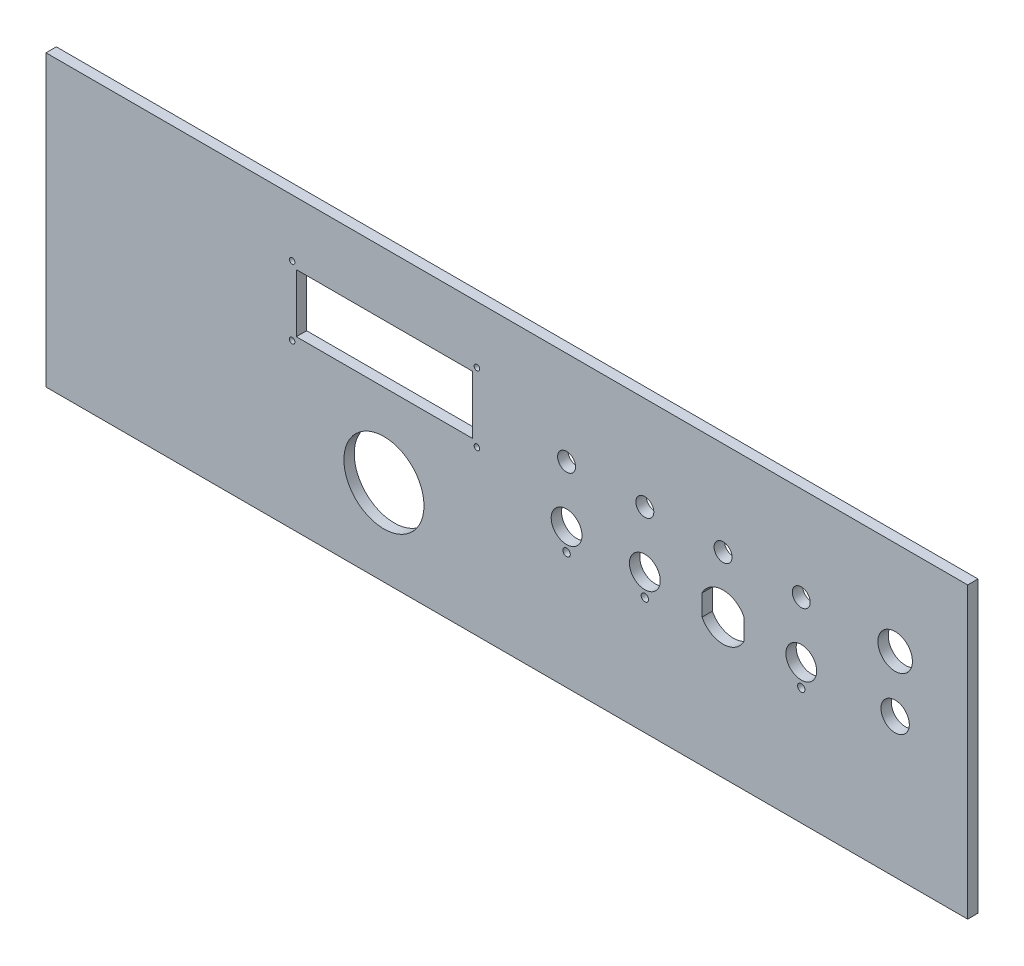
ISO-10303-21;
HEADER;
FILE_DESCRIPTION(('STEP AP214'),'2;1');
FILE_NAME('part.step','',(''),(''),'','','');
FILE_SCHEMA(('AUTOMOTIVE_DESIGN { 1 0 10303 214 1 1 1 1 }'));
ENDSEC;
DATA;
#1=APPLICATION_CONTEXT('core data for automotive mechanical design processes');
#2=APPLICATION_PROTOCOL_DEFINITION('international standard','automotive_design',2000,#1);
#3=PRODUCT_CONTEXT('',#1,'mechanical');
#4=PRODUCT('Part','Part','',(#3));
#5=PRODUCT_RELATED_PRODUCT_CATEGORY('part','',(#4));
#6=PRODUCT_DEFINITION_FORMATION('','',#4);
#7=PRODUCT_DEFINITION_CONTEXT('part definition',#1,'design');
#8=PRODUCT_DEFINITION('design','',#6,#7);
#9=PRODUCT_DEFINITION_SHAPE('','',#8);
#10=(LENGTH_UNIT() NAMED_UNIT(*) SI_UNIT(.MILLI.,.METRE.));
#11=(NAMED_UNIT(*) PLANE_ANGLE_UNIT() SI_UNIT($,.RADIAN.));
#12=(NAMED_UNIT(*) SI_UNIT($,.STERADIAN.) SOLID_ANGLE_UNIT());
#13=UNCERTAINTY_MEASURE_WITH_UNIT(LENGTH_MEASURE(1.E-05),#10,'distance_accuracy_value','');
#14=(GEOMETRIC_REPRESENTATION_CONTEXT(3) GLOBAL_UNCERTAINTY_ASSIGNED_CONTEXT((#13)) GLOBAL_UNIT_ASSIGNED_CONTEXT((#10,
#11,#12)) REPRESENTATION_CONTEXT('',''));
#15=CARTESIAN_POINT('',(0.,0.,0.));
#16=DIRECTION('',(0.,0.,1.));
#17=DIRECTION('',(1.,0.,0.));
#18=AXIS2_PLACEMENT_3D('',#15,#16,#17);
#19=CARTESIAN_POINT('',(0.,0.,4.191));
#20=DIRECTION('',(0.,0.,-1.));
#21=DIRECTION('',(-1.,0.,0.));
#22=AXIS2_PLACEMENT_3D('',#19,#20,#21);
#23=PLANE('',#22);
#24=CARTESIAN_POINT('',(344.65,56.5404,4.191));
#25=DIRECTION('',(0.,0.,1.));
#26=DIRECTION('',(1.,0.,0.));
#27=AXIS2_PLACEMENT_3D('',#24,#25,#26);
#28=CIRCLE('',#27,5.75310000000001);
#29=CARTESIAN_POINT('',(350.4031,56.5404,4.191));
#30=VERTEX_POINT('',#29);
#31=EDGE_CURVE('E595',#30,#30,#28,.T.);
#32=ORIENTED_EDGE('',*,*,#31,.F.);
#33=EDGE_LOOP('',(#32));
#34=FACE_BOUND('',#33,.T.);
#35=CARTESIAN_POINT('',(344.65,79.4004,4.191));
#36=DIRECTION('',(0.,0.,1.));
#37=DIRECTION('',(1.,0.,0.));
#38=AXIS2_PLACEMENT_3D('',#35,#36,#37);
#39=CIRCLE('',#38,6.99999999999999);
#40=CARTESIAN_POINT('',(351.65,79.4004,4.191));
#41=VERTEX_POINT('',#40);
#42=EDGE_CURVE('E597',#41,#41,#39,.T.);
#43=ORIENTED_EDGE('',*,*,#42,.F.);
#44=EDGE_LOOP('',(#43));
#45=FACE_BOUND('',#44,.T.);
#46=CARTESIAN_POINT('',(306.55,47.5488,4.191));
#47=DIRECTION('',(0.,0.,1.));
#48=DIRECTION('',(1.,0.,0.));
#49=AXIS2_PLACEMENT_3D('',#46,#47,#48);
#50=CIRCLE('',#49,1.4986);
#51=CARTESIAN_POINT('',(308.0486,47.5488,4.191));
#52=VERTEX_POINT('',#51);
#53=EDGE_CURVE('E603',#52,#52,#50,.T.);
#54=ORIENTED_EDGE('',*,*,#53,.F.);
#55=EDGE_LOOP('',(#54));
#56=FACE_BOUND('',#55,.T.);
#57=CARTESIAN_POINT('',(306.55,56.5404,4.191));
#58=DIRECTION('',(0.,0.,1.));
#59=DIRECTION('',(1.,0.,0.));
#60=AXIS2_PLACEMENT_3D('',#57,#58,#59);
#61=CIRCLE('',#60,6.24839999999998);
#62=CARTESIAN_POINT('',(312.7984,56.5404,4.191));
#63=VERTEX_POINT('',#62);
#64=EDGE_CURVE('E609',#63,#63,#61,.T.);
#65=ORIENTED_EDGE('',*,*,#64,.F.);
#66=EDGE_LOOP('',(#65));
#67=FACE_BOUND('',#66,.T.);
#68=CARTESIAN_POINT('',(306.55,79.4004,4.191));
#69=DIRECTION('',(0.,0.,1.));
#70=DIRECTION('',(1.,0.,0.));
#71=AXIS2_PLACEMENT_3D('',#68,#69,#70);
#72=CIRCLE('',#71,3.6449);
#73=CARTESIAN_POINT('',(310.1949,79.4004,4.191));
#74=VERTEX_POINT('',#73);
#75=EDGE_CURVE('E146',#74,#74,#72,.T.);
#76=ORIENTED_EDGE('',*,*,#75,.F.);
#77=EDGE_LOOP('',(#76));
#78=FACE_BOUND('',#77,.T.);
#79=DIRECTION('',(0.,-1.,0.));
#80=VECTOR('',#79,1.);
#81=CARTESIAN_POINT('',(266.291,52.2882510973862,4.191));
#82=LINE('',#81,#80);
#83=CARTESIAN_POINT('',(266.291,60.7925489026138,4.191));
#84=VERTEX_POINT('',#83);
#85=CARTESIAN_POINT('',(266.291,52.2882510973862,4.191));
#86=VERTEX_POINT('',#85);
#87=EDGE_CURVE('E152',#84,#86,#82,.T.);
#88=ORIENTED_EDGE('',*,*,#87,.F.);
#89=CARTESIAN_POINT('',(274.8,56.5404,4.191));
#90=DIRECTION('',(0.,0.,1.));
#91=DIRECTION('',(1.,0.,0.));
#92=AXIS2_PLACEMENT_3D('',#89,#90,#91);
#93=CIRCLE('',#92,9.5123);
#94=CARTESIAN_POINT('',(283.309,60.7925489026138,4.191));
#95=VERTEX_POINT('',#94);
#96=EDGE_CURVE('E48',#95,#84,#93,.T.);
#97=ORIENTED_EDGE('',*,*,#96,.F.);
#98=DIRECTION('',(0.,1.,0.));
#99=VECTOR('',#98,1.);
#100=CARTESIAN_POINT('',(283.309,52.2882510973861,4.191));
#101=LINE('',#100,#99);
#102=CARTESIAN_POINT('',(283.309,52.2882510973861,4.191));
#103=VERTEX_POINT('',#102);
#104=EDGE_CURVE('E140',#103,#95,#101,.T.);
#105=ORIENTED_EDGE('',*,*,#104,.F.);
#106=CARTESIAN_POINT('',(274.8,56.5404,4.191));
#107=DIRECTION('',(0.,0.,1.));
#108=DIRECTION('',(1.,0.,0.));
#109=AXIS2_PLACEMENT_3D('',#106,#107,#108);
#110=CIRCLE('',#109,9.5123);
#111=EDGE_CURVE('E143',#86,#103,#110,.T.);
#112=ORIENTED_EDGE('',*,*,#111,.F.);
#113=EDGE_LOOP('',(#88,#97,#105,#112));
#114=FACE_BOUND('',#113,.T.);
#115=CARTESIAN_POINT('',(274.8,79.4004,4.191));
#116=DIRECTION('',(0.,0.,1.));
#117=DIRECTION('',(1.,0.,0.));
#118=AXIS2_PLACEMENT_3D('',#115,#116,#117);
#119=CIRCLE('',#118,3.6449);
#120=CARTESIAN_POINT('',(278.4449,79.4004,4.191));
#121=VERTEX_POINT('',#120);
#122=EDGE_CURVE('E159',#121,#121,#119,.T.);
#123=ORIENTED_EDGE('',*,*,#122,.F.);
#124=EDGE_LOOP('',(#123));
#125=FACE_BOUND('',#124,.T.);
#126=CARTESIAN_POINT('',(243.05,47.5488,4.191));
#127=DIRECTION('',(0.,0.,1.));
#128=DIRECTION('',(1.,0.,0.));
#129=AXIS2_PLACEMENT_3D('',#126,#127,#128);
#130=CIRCLE('',#129,1.4986);
#131=CARTESIAN_POINT('',(244.5486,47.5488,4.191));
#132=VERTEX_POINT('',#131);
#133=EDGE_CURVE('E166',#132,#132,#130,.T.);
#134=ORIENTED_EDGE('',*,*,#133,.F.);
#135=EDGE_LOOP('',(#134));
#136=FACE_BOUND('',#135,.T.);
#137=CARTESIAN_POINT('',(243.05,56.5404,4.191));
#138=DIRECTION('',(0.,0.,1.));
#139=DIRECTION('',(1.,0.,0.));
#140=AXIS2_PLACEMENT_3D('',#137,#138,#139);
#141=CIRCLE('',#140,6.24839999999998);
#142=CARTESIAN_POINT('',(249.2984,56.5404,4.191));
#143=VERTEX_POINT('',#142);
#144=EDGE_CURVE('E172',#143,#143,#141,.T.);
#145=ORIENTED_EDGE('',*,*,#144,.F.);
#146=EDGE_LOOP('',(#145));
#147=FACE_BOUND('',#146,.T.);
#148=CARTESIAN_POINT('',(243.05,79.4004,4.191));
#149=DIRECTION('',(0.,0.,1.));
#150=DIRECTION('',(1.,0.,0.));
#151=AXIS2_PLACEMENT_3D('',#148,#149,#150);
#152=CIRCLE('',#151,3.6449);
#153=CARTESIAN_POINT('',(246.6949,79.4004,4.191));
#154=VERTEX_POINT('',#153);
#155=EDGE_CURVE('E178',#154,#154,#152,.T.);
#156=ORIENTED_EDGE('',*,*,#155,.F.);
#157=EDGE_LOOP('',(#156));
#158=FACE_BOUND('',#157,.T.);
#159=CARTESIAN_POINT('',(211.3,47.5488,4.191));
#160=DIRECTION('',(0.,0.,1.));
#161=DIRECTION('',(1.,0.,0.));
#162=AXIS2_PLACEMENT_3D('',#159,#160,#161);
#163=CIRCLE('',#162,1.4986);
#164=CARTESIAN_POINT('',(212.7986,47.5488,4.191));
#165=VERTEX_POINT('',#164);
#166=EDGE_CURVE('E184',#165,#165,#163,.T.);
#167=ORIENTED_EDGE('',*,*,#166,.F.);
#168=EDGE_LOOP('',(#167));
#169=FACE_BOUND('',#168,.T.);
#170=CARTESIAN_POINT('',(211.3,56.5404,4.191));
#171=DIRECTION('',(0.,0.,1.));
#172=DIRECTION('',(1.,0.,0.));
#173=AXIS2_PLACEMENT_3D('',#170,#171,#172);
#174=CIRCLE('',#173,6.24839999999998);
#175=CARTESIAN_POINT('',(217.5484,56.5404,4.191));
#176=VERTEX_POINT('',#175);
#177=EDGE_CURVE('E190',#176,#176,#174,.T.);
#178=ORIENTED_EDGE('',*,*,#177,.F.);
#179=EDGE_LOOP('',(#178));
#180=FACE_BOUND('',#179,.T.);
#181=CARTESIAN_POINT('',(211.3,79.4004,4.191));
#182=DIRECTION('',(0.,0.,1.));
#183=DIRECTION('',(1.,0.,0.));
#184=AXIS2_PLACEMENT_3D('',#181,#182,#183);
#185=CIRCLE('',#184,3.6449);
#186=CARTESIAN_POINT('',(214.9449,79.4004,4.191));
#187=VERTEX_POINT('',#186);
#188=EDGE_CURVE('E196',#187,#187,#185,.T.);
#189=ORIENTED_EDGE('',*,*,#188,.F.);
#190=EDGE_LOOP('',(#189));
#191=FACE_BOUND('',#190,.T.);
#192=CARTESIAN_POINT('',(99.9,94.3004,4.191));
#193=DIRECTION('',(0.,0.,1.));
#194=DIRECTION('',(1.,0.,0.));
#195=AXIS2_PLACEMENT_3D('',#192,#193,#194);
#196=CIRCLE('',#195,1.1303);
#197=CARTESIAN_POINT('',(101.0303,94.3004,4.191));
#198=VERTEX_POINT('',#197);
#199=EDGE_CURVE('E202',#198,#198,#196,.T.);
#200=ORIENTED_EDGE('',*,*,#199,.F.);
#201=EDGE_LOOP('',(#200));
#202=FACE_BOUND('',#201,.T.);
#203=CARTESIAN_POINT('',(174.9,94.3004,4.191));
#204=DIRECTION('',(0.,0.,1.));
#205=DIRECTION('',(1.,0.,0.));
#206=AXIS2_PLACEMENT_3D('',#203,#204,#205);
#207=CIRCLE('',#206,1.1303);
#208=CARTESIAN_POINT('',(176.0303,94.3004,4.191));
#209=VERTEX_POINT('',#208);
#210=EDGE_CURVE('E210',#209,#209,#207,.T.);
#211=ORIENTED_EDGE('',*,*,#210,.F.);
#212=EDGE_LOOP('',(#211));
#213=FACE_BOUND('',#212,.T.);
#214=CARTESIAN_POINT('',(174.9,66.3004,4.191));
#215=DIRECTION('',(0.,0.,1.));
#216=DIRECTION('',(1.,0.,0.));
#217=AXIS2_PLACEMENT_3D('',#214,#215,#216);
#218=CIRCLE('',#217,1.1303);
#219=CARTESIAN_POINT('',(176.0303,66.3004,4.191));
#220=VERTEX_POINT('',#219);
#221=EDGE_CURVE('E216',#220,#220,#218,.T.);
#222=ORIENTED_EDGE('',*,*,#221,.F.);
#223=EDGE_LOOP('',(#222));
#224=FACE_BOUND('',#223,.T.);
#225=CARTESIAN_POINT('',(99.9,66.3004,4.191));
#226=DIRECTION('',(0.,0.,1.));
#227=DIRECTION('',(1.,0.,0.));
#228=AXIS2_PLACEMENT_3D('',#225,#226,#227);
#229=CIRCLE('',#228,1.1303);
#230=CARTESIAN_POINT('',(101.0303,66.3004,4.191));
#231=VERTEX_POINT('',#230);
#232=EDGE_CURVE('E222',#231,#231,#229,.T.);
#233=ORIENTED_EDGE('',*,*,#232,.F.);
#234=EDGE_LOOP('',(#233));
#235=FACE_BOUND('',#234,.T.);
#236=DIRECTION('',(0.,-1.,0.));
#237=VECTOR('',#236,1.);
#238=CARTESIAN_POINT('',(0.,0.,4.191));
#239=LINE('',#238,#237);
#240=CARTESIAN_POINT('',(0.,117.5004,4.191));
#241=VERTEX_POINT('',#240);
#242=CARTESIAN_POINT('',(0.,0.,4.191));
#243=VERTEX_POINT('',#242);
#244=EDGE_CURVE('E266',#241,#243,#239,.T.);
#245=ORIENTED_EDGE('',*,*,#244,.T.);
#246=DIRECTION('',(1.,0.,0.));
#247=VECTOR('',#246,1.);
#248=CARTESIAN_POINT('',(0.,0.,4.191));
#249=LINE('',#248,#247);
#250=CARTESIAN_POINT('',(374.0912,0.,4.191));
#251=VERTEX_POINT('',#250);
#252=EDGE_CURVE('E269',#243,#251,#249,.T.);
#253=ORIENTED_EDGE('',*,*,#252,.T.);
#254=DIRECTION('',(0.,1.,0.));
#255=VECTOR('',#254,1.);
#256=CARTESIAN_POINT('',(374.0912,0.,4.191));
#257=LINE('',#256,#255);
#258=CARTESIAN_POINT('',(374.0912,117.5004,4.191));
#259=VERTEX_POINT('',#258);
#260=EDGE_CURVE('E272',#251,#259,#257,.T.);
#261=ORIENTED_EDGE('',*,*,#260,.T.);
#262=DIRECTION('',(-1.,0.,0.));
#263=VECTOR('',#262,1.);
#264=CARTESIAN_POINT('',(0.,117.5004,4.191));
#265=LINE('',#264,#263);
#266=EDGE_CURVE('E274',#259,#241,#265,.T.);
#267=ORIENTED_EDGE('',*,*,#266,.T.);
#268=EDGE_LOOP('',(#245,#253,#261,#267));
#269=FACE_BOUND('',#268,.T.);
#270=DIRECTION('',(0.,-1.,0.));
#271=VECTOR('',#270,1.);
#272=CARTESIAN_POINT('',(101.6,92.1004,4.191));
#273=LINE('',#272,#271);
#274=CARTESIAN_POINT('',(101.6,92.1004,4.191));
#275=VERTEX_POINT('',#274);
#276=CARTESIAN_POINT('',(101.6,68.5004,4.191));
#277=VERTEX_POINT('',#276);
#278=EDGE_CURVE('E235',#275,#277,#273,.T.);
#279=ORIENTED_EDGE('',*,*,#278,.F.);
#280=DIRECTION('',(-1.,0.,0.));
#281=VECTOR('',#280,1.);
#282=CARTESIAN_POINT('',(101.6,92.1004,4.191));
#283=LINE('',#282,#281);
#284=CARTESIAN_POINT('',(173.2,92.1004,4.191));
#285=VERTEX_POINT('',#284);
#286=EDGE_CURVE('E243',#285,#275,#283,.T.);
#287=ORIENTED_EDGE('',*,*,#286,.F.);
#288=DIRECTION('',(0.,1.,0.));
#289=VECTOR('',#288,1.);
#290=CARTESIAN_POINT('',(173.2,92.1004,4.191));
#291=LINE('',#290,#289);
#292=CARTESIAN_POINT('',(173.2,68.5004,4.191));
#293=VERTEX_POINT('',#292);
#294=EDGE_CURVE('E240',#293,#285,#291,.T.);
#295=ORIENTED_EDGE('',*,*,#294,.F.);
#296=DIRECTION('',(1.,0.,0.));
#297=VECTOR('',#296,1.);
#298=CARTESIAN_POINT('',(101.6,68.5004,4.191));
#299=LINE('',#298,#297);
#300=EDGE_CURVE('E237',#277,#293,#299,.T.);
#301=ORIENTED_EDGE('',*,*,#300,.F.);
#302=EDGE_LOOP('',(#279,#287,#295,#301));
#303=FACE_BOUND('',#302,.T.);
#304=CARTESIAN_POINT('',(137.16,34.9504,4.191));
#305=DIRECTION('',(0.,0.,1.));
#306=DIRECTION('',(1.,0.,0.));
#307=AXIS2_PLACEMENT_3D('',#304,#305,#306);
#308=CIRCLE('',#307,16.25);
#309=CARTESIAN_POINT('',(153.41,34.9504,4.191));
#310=VERTEX_POINT('',#309);
#311=EDGE_CURVE('E229',#310,#310,#308,.T.);
#312=ORIENTED_EDGE('',*,*,#311,.F.);
#313=EDGE_LOOP('',(#312));
#314=FACE_BOUND('',#313,.T.);
#315=ADVANCED_FACE('F33',(#34,#45,#56,#67,#78,#114,#125,#136,#147,#158,#169,#180,#191,#202,#213,
#224,#235,#269,#303,#314),#23,.F.);
#316=CARTESIAN_POINT('',(0.,0.,0.));
#317=DIRECTION('',(0.,0.,-1.));
#318=DIRECTION('',(-1.,0.,0.));
#319=AXIS2_PLACEMENT_3D('',#316,#317,#318);
#320=PLANE('',#319);
#321=CARTESIAN_POINT('',(344.65,56.5404,0.));
#322=DIRECTION('',(0.,0.,1.));
#323=DIRECTION('',(1.,0.,0.));
#324=AXIS2_PLACEMENT_3D('',#321,#322,#323);
#325=CIRCLE('',#324,5.75310000000001);
#326=CARTESIAN_POINT('',(350.4031,56.5404,0.));
#327=VERTEX_POINT('',#326);
#328=EDGE_CURVE('E593',#327,#327,#325,.T.);
#329=ORIENTED_EDGE('',*,*,#328,.T.);
#330=EDGE_LOOP('',(#329));
#331=FACE_BOUND('',#330,.T.);
#332=CARTESIAN_POINT('',(344.65,79.4004,0.));
#333=DIRECTION('',(0.,0.,1.));
#334=DIRECTION('',(1.,0.,0.));
#335=AXIS2_PLACEMENT_3D('',#332,#333,#334);
#336=CIRCLE('',#335,6.99999999999999);
#337=CARTESIAN_POINT('',(351.65,79.4004,0.));
#338=VERTEX_POINT('',#337);
#339=EDGE_CURVE('E600',#338,#338,#336,.T.);
#340=ORIENTED_EDGE('',*,*,#339,.T.);
#341=EDGE_LOOP('',(#340));
#342=FACE_BOUND('',#341,.T.);
#343=CARTESIAN_POINT('',(306.55,47.5488,0.));
#344=DIRECTION('',(0.,0.,1.));
#345=DIRECTION('',(1.,0.,0.));
#346=AXIS2_PLACEMENT_3D('',#343,#344,#345);
#347=CIRCLE('',#346,1.4986);
#348=CARTESIAN_POINT('',(308.0486,47.5488,0.));
#349=VERTEX_POINT('',#348);
#350=EDGE_CURVE('E606',#349,#349,#347,.T.);
#351=ORIENTED_EDGE('',*,*,#350,.T.);
#352=EDGE_LOOP('',(#351));
#353=FACE_BOUND('',#352,.T.);
#354=CARTESIAN_POINT('',(306.55,56.5404,0.));
#355=DIRECTION('',(0.,0.,1.));
#356=DIRECTION('',(1.,0.,0.));
#357=AXIS2_PLACEMENT_3D('',#354,#355,#356);
#358=CIRCLE('',#357,6.24839999999998);
#359=CARTESIAN_POINT('',(312.7984,56.5404,0.));
#360=VERTEX_POINT('',#359);
#361=EDGE_CURVE('E612',#360,#360,#358,.T.);
#362=ORIENTED_EDGE('',*,*,#361,.T.);
#363=EDGE_LOOP('',(#362));
#364=FACE_BOUND('',#363,.T.);
#365=CARTESIAN_POINT('',(306.55,79.4004,0.));
#366=DIRECTION('',(0.,0.,1.));
#367=DIRECTION('',(1.,0.,0.));
#368=AXIS2_PLACEMENT_3D('',#365,#366,#367);
#369=CIRCLE('',#368,3.6449);
#370=CARTESIAN_POINT('',(310.1949,79.4004,0.));
#371=VERTEX_POINT('',#370);
#372=EDGE_CURVE('E153',#371,#371,#369,.T.);
#373=ORIENTED_EDGE('',*,*,#372,.T.);
#374=EDGE_LOOP('',(#373));
#375=FACE_BOUND('',#374,.T.);
#376=CARTESIAN_POINT('',(274.8,56.5404,0.));
#377=DIRECTION('',(0.,0.,1.));
#378=DIRECTION('',(1.,0.,0.));
#379=AXIS2_PLACEMENT_3D('',#376,#377,#378);
#380=CIRCLE('',#379,9.5123);
#381=CARTESIAN_POINT('',(283.309,60.7925489026138,0.));
#382=VERTEX_POINT('',#381);
#383=CARTESIAN_POINT('',(266.291,60.7925489026138,0.));
#384=VERTEX_POINT('',#383);
#385=EDGE_CURVE('E124',#382,#384,#380,.T.);
#386=ORIENTED_EDGE('',*,*,#385,.T.);
#387=DIRECTION('',(0.,-1.,0.));
#388=VECTOR('',#387,1.);
#389=CARTESIAN_POINT('',(266.291,52.2882510973862,0.));
#390=LINE('',#389,#388);
#391=CARTESIAN_POINT('',(266.291,52.2882510973862,0.));
#392=VERTEX_POINT('',#391);
#393=EDGE_CURVE('E133',#384,#392,#390,.T.);
#394=ORIENTED_EDGE('',*,*,#393,.T.);
#395=CARTESIAN_POINT('',(274.8,56.5404,0.));
#396=DIRECTION('',(0.,0.,1.));
#397=DIRECTION('',(1.,0.,0.));
#398=AXIS2_PLACEMENT_3D('',#395,#396,#397);
#399=CIRCLE('',#398,9.5123);
#400=CARTESIAN_POINT('',(283.309,52.2882510973861,0.));
#401=VERTEX_POINT('',#400);
#402=EDGE_CURVE('E56',#392,#401,#399,.T.);
#403=ORIENTED_EDGE('',*,*,#402,.T.);
#404=DIRECTION('',(0.,1.,0.));
#405=VECTOR('',#404,1.);
#406=CARTESIAN_POINT('',(283.309,52.2882510973861,0.));
#407=LINE('',#406,#405);
#408=EDGE_CURVE('E130',#401,#382,#407,.T.);
#409=ORIENTED_EDGE('',*,*,#408,.T.);
#410=EDGE_LOOP('',(#386,#394,#403,#409));
#411=FACE_BOUND('',#410,.T.);
#412=CARTESIAN_POINT('',(274.8,79.4004,0.));
#413=DIRECTION('',(0.,0.,1.));
#414=DIRECTION('',(1.,0.,0.));
#415=AXIS2_PLACEMENT_3D('',#412,#413,#414);
#416=CIRCLE('',#415,3.6449);
#417=CARTESIAN_POINT('',(278.4449,79.4004,0.));
#418=VERTEX_POINT('',#417);
#419=EDGE_CURVE('E163',#418,#418,#416,.T.);
#420=ORIENTED_EDGE('',*,*,#419,.T.);
#421=EDGE_LOOP('',(#420));
#422=FACE_BOUND('',#421,.T.);
#423=CARTESIAN_POINT('',(243.05,47.5488,0.));
#424=DIRECTION('',(0.,0.,1.));
#425=DIRECTION('',(1.,0.,0.));
#426=AXIS2_PLACEMENT_3D('',#423,#424,#425);
#427=CIRCLE('',#426,1.4986);
#428=CARTESIAN_POINT('',(244.5486,47.5488,0.));
#429=VERTEX_POINT('',#428);
#430=EDGE_CURVE('E169',#429,#429,#427,.T.);
#431=ORIENTED_EDGE('',*,*,#430,.T.);
#432=EDGE_LOOP('',(#431));
#433=FACE_BOUND('',#432,.T.);
#434=CARTESIAN_POINT('',(243.05,56.5404,0.));
#435=DIRECTION('',(0.,0.,1.));
#436=DIRECTION('',(1.,0.,0.));
#437=AXIS2_PLACEMENT_3D('',#434,#435,#436);
#438=CIRCLE('',#437,6.24839999999998);
#439=CARTESIAN_POINT('',(249.2984,56.5404,0.));
#440=VERTEX_POINT('',#439);
#441=EDGE_CURVE('E175',#440,#440,#438,.T.);
#442=ORIENTED_EDGE('',*,*,#441,.T.);
#443=EDGE_LOOP('',(#442));
#444=FACE_BOUND('',#443,.T.);
#445=CARTESIAN_POINT('',(243.05,79.4004,0.));
#446=DIRECTION('',(0.,0.,1.));
#447=DIRECTION('',(1.,0.,0.));
#448=AXIS2_PLACEMENT_3D('',#445,#446,#447);
#449=CIRCLE('',#448,3.6449);
#450=CARTESIAN_POINT('',(246.6949,79.4004,0.));
#451=VERTEX_POINT('',#450);
#452=EDGE_CURVE('E181',#451,#451,#449,.T.);
#453=ORIENTED_EDGE('',*,*,#452,.T.);
#454=EDGE_LOOP('',(#453));
#455=FACE_BOUND('',#454,.T.);
#456=CARTESIAN_POINT('',(211.3,47.5488,0.));
#457=DIRECTION('',(0.,0.,1.));
#458=DIRECTION('',(1.,0.,0.));
#459=AXIS2_PLACEMENT_3D('',#456,#457,#458);
#460=CIRCLE('',#459,1.4986);
#461=CARTESIAN_POINT('',(212.7986,47.5488,0.));
#462=VERTEX_POINT('',#461);
#463=EDGE_CURVE('E187',#462,#462,#460,.T.);
#464=ORIENTED_EDGE('',*,*,#463,.T.);
#465=EDGE_LOOP('',(#464));
#466=FACE_BOUND('',#465,.T.);
#467=CARTESIAN_POINT('',(211.3,56.5404,0.));
#468=DIRECTION('',(0.,0.,1.));
#469=DIRECTION('',(1.,0.,0.));
#470=AXIS2_PLACEMENT_3D('',#467,#468,#469);
#471=CIRCLE('',#470,6.24839999999998);
#472=CARTESIAN_POINT('',(217.5484,56.5404,0.));
#473=VERTEX_POINT('',#472);
#474=EDGE_CURVE('E193',#473,#473,#471,.T.);
#475=ORIENTED_EDGE('',*,*,#474,.T.);
#476=EDGE_LOOP('',(#475));
#477=FACE_BOUND('',#476,.T.);
#478=CARTESIAN_POINT('',(211.3,79.4004,0.));
#479=DIRECTION('',(0.,0.,1.));
#480=DIRECTION('',(1.,0.,0.));
#481=AXIS2_PLACEMENT_3D('',#478,#479,#480);
#482=CIRCLE('',#481,3.6449);
#483=CARTESIAN_POINT('',(214.9449,79.4004,0.));
#484=VERTEX_POINT('',#483);
#485=EDGE_CURVE('E199',#484,#484,#482,.T.);
#486=ORIENTED_EDGE('',*,*,#485,.T.);
#487=EDGE_LOOP('',(#486));
#488=FACE_BOUND('',#487,.T.);
#489=CARTESIAN_POINT('',(99.9,94.3004,0.));
#490=DIRECTION('',(0.,0.,-1.));
#491=DIRECTION('',(-1.,0.,0.));
#492=AXIS2_PLACEMENT_3D('',#489,#490,#491);
#493=CIRCLE('',#492,1.1303);
#494=CARTESIAN_POINT('',(98.7697,94.3004,0.));
#495=VERTEX_POINT('',#494);
#496=EDGE_CURVE('E207',#495,#495,#493,.T.);
#497=ORIENTED_EDGE('',*,*,#496,.F.);
#498=EDGE_LOOP('',(#497));
#499=FACE_BOUND('',#498,.T.);
#500=CARTESIAN_POINT('',(174.9,94.3004,0.));
#501=DIRECTION('',(0.,0.,-1.));
#502=DIRECTION('',(-1.,0.,0.));
#503=AXIS2_PLACEMENT_3D('',#500,#501,#502);
#504=CIRCLE('',#503,1.1303);
#505=CARTESIAN_POINT('',(173.7697,94.3004,0.));
#506=VERTEX_POINT('',#505);
#507=EDGE_CURVE('E213',#506,#506,#504,.T.);
#508=ORIENTED_EDGE('',*,*,#507,.F.);
#509=EDGE_LOOP('',(#508));
#510=FACE_BOUND('',#509,.T.);
#511=CARTESIAN_POINT('',(174.9,66.3004,0.));
#512=DIRECTION('',(0.,0.,-1.));
#513=DIRECTION('',(-1.,0.,0.));
#514=AXIS2_PLACEMENT_3D('',#511,#512,#513);
#515=CIRCLE('',#514,1.1303);
#516=CARTESIAN_POINT('',(173.7697,66.3004,0.));
#517=VERTEX_POINT('',#516);
#518=EDGE_CURVE('E219',#517,#517,#515,.T.);
#519=ORIENTED_EDGE('',*,*,#518,.F.);
#520=EDGE_LOOP('',(#519));
#521=FACE_BOUND('',#520,.T.);
#522=CARTESIAN_POINT('',(99.9,66.3004,0.));
#523=DIRECTION('',(0.,0.,-1.));
#524=DIRECTION('',(-1.,0.,0.));
#525=AXIS2_PLACEMENT_3D('',#522,#523,#524);
#526=CIRCLE('',#525,1.1303);
#527=CARTESIAN_POINT('',(98.7697,66.3004,0.));
#528=VERTEX_POINT('',#527);
#529=EDGE_CURVE('E225',#528,#528,#526,.T.);
#530=ORIENTED_EDGE('',*,*,#529,.F.);
#531=EDGE_LOOP('',(#530));
#532=FACE_BOUND('',#531,.T.);
#533=DIRECTION('',(-1.,0.,0.));
#534=VECTOR('',#533,1.);
#535=CARTESIAN_POINT('',(101.6,92.1004,0.));
#536=LINE('',#535,#534);
#537=CARTESIAN_POINT('',(173.2,92.1004,0.));
#538=VERTEX_POINT('',#537);
#539=CARTESIAN_POINT('',(101.6,92.1004,0.));
#540=VERTEX_POINT('',#539);
#541=EDGE_CURVE('E238',#538,#540,#536,.T.);
#542=ORIENTED_EDGE('',*,*,#541,.T.);
#543=DIRECTION('',(0.,-1.,0.));
#544=VECTOR('',#543,1.);
#545=CARTESIAN_POINT('',(101.6,92.1004,0.));
#546=LINE('',#545,#544);
#547=CARTESIAN_POINT('',(101.6,68.5004,0.));
#548=VERTEX_POINT('',#547);
#549=EDGE_CURVE('E232',#540,#548,#546,.T.);
#550=ORIENTED_EDGE('',*,*,#549,.T.);
#551=DIRECTION('',(1.,0.,0.));
#552=VECTOR('',#551,1.);
#553=CARTESIAN_POINT('',(101.6,68.5004,0.));
#554=LINE('',#553,#552);
#555=CARTESIAN_POINT('',(173.2,68.5004,0.));
#556=VERTEX_POINT('',#555);
#557=EDGE_CURVE('E248',#548,#556,#554,.T.);
#558=ORIENTED_EDGE('',*,*,#557,.T.);
#559=DIRECTION('',(0.,1.,0.));
#560=VECTOR('',#559,1.);
#561=CARTESIAN_POINT('',(173.2,92.1004,0.));
#562=LINE('',#561,#560);
#563=EDGE_CURVE('E251',#556,#538,#562,.T.);
#564=ORIENTED_EDGE('',*,*,#563,.T.);
#565=EDGE_LOOP('',(#542,#550,#558,#564));
#566=FACE_BOUND('',#565,.T.);
#567=DIRECTION('',(0.,-1.,0.));
#568=VECTOR('',#567,1.);
#569=CARTESIAN_POINT('',(0.,0.,0.));
#570=LINE('',#569,#568);
#571=CARTESIAN_POINT('',(0.,117.5004,0.));
#572=VERTEX_POINT('',#571);
#573=CARTESIAN_POINT('',(0.,0.,0.));
#574=VERTEX_POINT('',#573);
#575=EDGE_CURVE('E265',#572,#574,#570,.T.);
#576=ORIENTED_EDGE('',*,*,#575,.F.);
#577=DIRECTION('',(-1.,0.,0.));
#578=VECTOR('',#577,1.);
#579=CARTESIAN_POINT('',(0.,117.5004,0.));
#580=LINE('',#579,#578);
#581=CARTESIAN_POINT('',(374.0912,117.5004,0.));
#582=VERTEX_POINT('',#581);
#583=EDGE_CURVE('E270',#582,#572,#580,.T.);
#584=ORIENTED_EDGE('',*,*,#583,.F.);
#585=DIRECTION('',(0.,1.,0.));
#586=VECTOR('',#585,1.);
#587=CARTESIAN_POINT('',(374.0912,0.,0.));
#588=LINE('',#587,#586);
#589=CARTESIAN_POINT('',(374.0912,0.,0.));
#590=VERTEX_POINT('',#589);
#591=EDGE_CURVE('E281',#590,#582,#588,.T.);
#592=ORIENTED_EDGE('',*,*,#591,.F.);
#593=DIRECTION('',(1.,0.,0.));
#594=VECTOR('',#593,1.);
#595=CARTESIAN_POINT('',(0.,0.,0.));
#596=LINE('',#595,#594);
#597=EDGE_CURVE('E279',#574,#590,#596,.T.);
#598=ORIENTED_EDGE('',*,*,#597,.F.);
#599=EDGE_LOOP('',(#576,#584,#592,#598));
#600=FACE_BOUND('',#599,.T.);
#601=CARTESIAN_POINT('',(137.16,34.9504,0.));
#602=DIRECTION('',(0.,0.,1.));
#603=DIRECTION('',(1.,0.,0.));
#604=AXIS2_PLACEMENT_3D('',#601,#602,#603);
#605=CIRCLE('',#604,16.25);
#606=CARTESIAN_POINT('',(153.41,34.9504,0.));
#607=VERTEX_POINT('',#606);
#608=EDGE_CURVE('E228',#607,#607,#605,.T.);
#609=ORIENTED_EDGE('',*,*,#608,.T.);
#610=EDGE_LOOP('',(#609));
#611=FACE_BOUND('',#610,.T.);
#612=ADVANCED_FACE('F137',(#331,#342,#353,#364,#375,#411,#422,#433,#444,#455,#466,#477,#488,
#499,#510,#521,#532,#566,#600,#611),#320,.T.);
#613=CARTESIAN_POINT('',(0.,0.,4.191));
#614=DIRECTION('',(1.,0.,0.));
#615=DIRECTION('',(0.,0.,-1.));
#616=AXIS2_PLACEMENT_3D('',#613,#614,#615);
#617=PLANE('',#616);
#618=ORIENTED_EDGE('',*,*,#575,.T.);
#619=DIRECTION('',(0.,0.,-1.));
#620=VECTOR('',#619,1.);
#621=CARTESIAN_POINT('',(0.,0.,4.191));
#622=LINE('',#621,#620);
#623=EDGE_CURVE('E11',#243,#574,#622,.T.);
#624=ORIENTED_EDGE('',*,*,#623,.F.);
#625=ORIENTED_EDGE('',*,*,#244,.F.);
#626=DIRECTION('',(0.,0.,-1.));
#627=VECTOR('',#626,1.);
#628=CARTESIAN_POINT('',(0.,117.5004,4.191));
#629=LINE('',#628,#627);
#630=EDGE_CURVE('E276',#241,#572,#629,.T.);
#631=ORIENTED_EDGE('',*,*,#630,.T.);
#632=EDGE_LOOP('',(#618,#624,#625,#631));
#633=FACE_BOUND('',#632,.T.);
#634=ADVANCED_FACE('F35',(#633),#617,.F.);
#635=CARTESIAN_POINT('',(0.,0.,4.191));
#636=DIRECTION('',(0.,1.,0.));
#637=DIRECTION('',(0.,0.,1.));
#638=AXIS2_PLACEMENT_3D('',#635,#636,#637);
#639=PLANE('',#638);
#640=ORIENTED_EDGE('',*,*,#597,.T.);
#641=DIRECTION('',(0.,0.,-1.));
#642=VECTOR('',#641,1.);
#643=CARTESIAN_POINT('',(374.0912,0.,4.191));
#644=LINE('',#643,#642);
#645=EDGE_CURVE('E41',#251,#590,#644,.T.);
#646=ORIENTED_EDGE('',*,*,#645,.F.);
#647=ORIENTED_EDGE('',*,*,#252,.F.);
#648=ORIENTED_EDGE('',*,*,#623,.T.);
#649=EDGE_LOOP('',(#640,#646,#647,#648));
#650=FACE_BOUND('',#649,.T.);
#651=ADVANCED_FACE('F309',(#650),#639,.F.);
#652=CARTESIAN_POINT('',(374.0912,0.,4.191));
#653=DIRECTION('',(-1.,0.,0.));
#654=DIRECTION('',(0.,-1.,0.));
#655=AXIS2_PLACEMENT_3D('',#652,#653,#654);
#656=PLANE('',#655);
#657=ORIENTED_EDGE('',*,*,#591,.T.);
#658=DIRECTION('',(0.,0.,-1.));
#659=VECTOR('',#658,1.);
#660=CARTESIAN_POINT('',(374.0912,117.5004,4.191));
#661=LINE('',#660,#659);
#662=EDGE_CURVE('E286',#259,#582,#661,.T.);
#663=ORIENTED_EDGE('',*,*,#662,.F.);
#664=ORIENTED_EDGE('',*,*,#260,.F.);
#665=ORIENTED_EDGE('',*,*,#645,.T.);
#666=EDGE_LOOP('',(#657,#663,#664,#665));
#667=FACE_BOUND('',#666,.T.);
#668=ADVANCED_FACE('F293',(#667),#656,.F.);
#669=CARTESIAN_POINT('',(0.,117.5004,4.191));
#670=DIRECTION('',(0.,-1.,0.));
#671=DIRECTION('',(1.,0.,0.));
#672=AXIS2_PLACEMENT_3D('',#669,#670,#671);
#673=PLANE('',#672);
#674=ORIENTED_EDGE('',*,*,#583,.T.);
#675=ORIENTED_EDGE('',*,*,#630,.F.);
#676=ORIENTED_EDGE('',*,*,#266,.F.);
#677=ORIENTED_EDGE('',*,*,#662,.T.);
#678=EDGE_LOOP('',(#674,#675,#676,#677));
#679=FACE_BOUND('',#678,.T.);
#680=ADVANCED_FACE('F302',(#679),#673,.F.);
#681=CARTESIAN_POINT('',(101.6,92.1004,4.191));
#682=DIRECTION('',(1.,0.,0.));
#683=DIRECTION('',(0.,0.,-1.));
#684=AXIS2_PLACEMENT_3D('',#681,#682,#683);
#685=PLANE('',#684);
#686=ORIENTED_EDGE('',*,*,#549,.F.);
#687=DIRECTION('',(0.,0.,-1.));
#688=VECTOR('',#687,1.);
#689=CARTESIAN_POINT('',(101.6,92.1004,4.191));
#690=LINE('',#689,#688);
#691=EDGE_CURVE('E245',#275,#540,#690,.T.);
#692=ORIENTED_EDGE('',*,*,#691,.F.);
#693=ORIENTED_EDGE('',*,*,#278,.T.);
#694=DIRECTION('',(0.,0.,-1.));
#695=VECTOR('',#694,1.);
#696=CARTESIAN_POINT('',(101.6,68.5004,4.191));
#697=LINE('',#696,#695);
#698=EDGE_CURVE('E262',#277,#548,#697,.T.);
#699=ORIENTED_EDGE('',*,*,#698,.T.);
#700=EDGE_LOOP('',(#686,#692,#693,#699));
#701=FACE_BOUND('',#700,.T.);
#702=ADVANCED_FACE('F327',(#701),#685,.T.);
#703=CARTESIAN_POINT('',(101.6,68.5004,4.191));
#704=DIRECTION('',(0.,1.,0.));
#705=DIRECTION('',(0.,0.,1.));
#706=AXIS2_PLACEMENT_3D('',#703,#704,#705);
#707=PLANE('',#706);
#708=ORIENTED_EDGE('',*,*,#557,.F.);
#709=ORIENTED_EDGE('',*,*,#698,.F.);
#710=ORIENTED_EDGE('',*,*,#300,.T.);
#711=DIRECTION('',(0.,0.,-1.));
#712=VECTOR('',#711,1.);
#713=CARTESIAN_POINT('',(173.2,68.5004,4.191));
#714=LINE('',#713,#712);
#715=EDGE_CURVE('E260',#293,#556,#714,.T.);
#716=ORIENTED_EDGE('',*,*,#715,.T.);
#717=EDGE_LOOP('',(#708,#709,#710,#716));
#718=FACE_BOUND('',#717,.T.);
#719=ADVANCED_FACE('F334',(#718),#707,.T.);
#720=CARTESIAN_POINT('',(173.2,92.1004,4.191));
#721=DIRECTION('',(-1.,0.,0.));
#722=DIRECTION('',(0.,0.,1.));
#723=AXIS2_PLACEMENT_3D('',#720,#721,#722);
#724=PLANE('',#723);
#725=ORIENTED_EDGE('',*,*,#563,.F.);
#726=ORIENTED_EDGE('',*,*,#715,.F.);
#727=ORIENTED_EDGE('',*,*,#294,.T.);
#728=DIRECTION('',(0.,0.,-1.));
#729=VECTOR('',#728,1.);
#730=CARTESIAN_POINT('',(173.2,92.1004,4.191));
#731=LINE('',#730,#729);
#732=EDGE_CURVE('E258',#285,#538,#731,.T.);
#733=ORIENTED_EDGE('',*,*,#732,.T.);
#734=EDGE_LOOP('',(#725,#726,#727,#733));
#735=FACE_BOUND('',#734,.T.);
#736=ADVANCED_FACE('F339',(#735),#724,.T.);
#737=CARTESIAN_POINT('',(101.6,92.1004,4.191));
#738=DIRECTION('',(0.,-1.,0.));
#739=DIRECTION('',(0.,0.,-1.));
#740=AXIS2_PLACEMENT_3D('',#737,#738,#739);
#741=PLANE('',#740);
#742=ORIENTED_EDGE('',*,*,#541,.F.);
#743=ORIENTED_EDGE('',*,*,#732,.F.);
#744=ORIENTED_EDGE('',*,*,#286,.T.);
#745=ORIENTED_EDGE('',*,*,#691,.T.);
#746=EDGE_LOOP('',(#742,#743,#744,#745));
#747=FACE_BOUND('',#746,.T.);
#748=ADVANCED_FACE('F347',(#747),#741,.T.);
#749=CARTESIAN_POINT('',(137.16,34.9504,4.191));
#750=DIRECTION('',(0.,0.,-1.));
#751=DIRECTION('',(-1.,0.,0.));
#752=AXIS2_PLACEMENT_3D('',#749,#750,#751);
#753=CYLINDRICAL_SURFACE('',#752,16.25);
#754=ORIENTED_EDGE('',*,*,#311,.T.);
#755=EDGE_LOOP('',(#754));
#756=FACE_BOUND('',#755,.T.);
#757=ORIENTED_EDGE('',*,*,#608,.F.);
#758=EDGE_LOOP('',(#757));
#759=FACE_BOUND('',#758,.T.);
#760=ADVANCED_FACE('F357',(#756,#759),#753,.F.);
#761=CARTESIAN_POINT('',(99.9,66.3004,4.191));
#762=DIRECTION('',(0.,0.,1.));
#763=DIRECTION('',(1.,0.,0.));
#764=AXIS2_PLACEMENT_3D('',#761,#762,#763);
#765=CYLINDRICAL_SURFACE('',#764,1.1303);
#766=ORIENTED_EDGE('',*,*,#232,.T.);
#767=EDGE_LOOP('',(#766));
#768=FACE_BOUND('',#767,.T.);
#769=ORIENTED_EDGE('',*,*,#529,.T.);
#770=EDGE_LOOP('',(#769));
#771=FACE_BOUND('',#770,.T.);
#772=ADVANCED_FACE('F360',(#768,#771),#765,.F.);
#773=CARTESIAN_POINT('',(174.9,66.3004,4.191));
#774=DIRECTION('',(0.,0.,1.));
#775=DIRECTION('',(1.,0.,0.));
#776=AXIS2_PLACEMENT_3D('',#773,#774,#775);
#777=CYLINDRICAL_SURFACE('',#776,1.1303);
#778=ORIENTED_EDGE('',*,*,#221,.T.);
#779=EDGE_LOOP('',(#778));
#780=FACE_BOUND('',#779,.T.);
#781=ORIENTED_EDGE('',*,*,#518,.T.);
#782=EDGE_LOOP('',(#781));
#783=FACE_BOUND('',#782,.T.);
#784=ADVANCED_FACE('F367',(#780,#783),#777,.F.);
#785=CARTESIAN_POINT('',(174.9,94.3004,4.191));
#786=DIRECTION('',(0.,0.,1.));
#787=DIRECTION('',(1.,0.,0.));
#788=AXIS2_PLACEMENT_3D('',#785,#786,#787);
#789=CYLINDRICAL_SURFACE('',#788,1.1303);
#790=ORIENTED_EDGE('',*,*,#210,.T.);
#791=EDGE_LOOP('',(#790));
#792=FACE_BOUND('',#791,.T.);
#793=ORIENTED_EDGE('',*,*,#507,.T.);
#794=EDGE_LOOP('',(#793));
#795=FACE_BOUND('',#794,.T.);
#796=ADVANCED_FACE('F401',(#792,#795),#789,.F.);
#797=CARTESIAN_POINT('',(99.9,94.3004,4.191));
#798=DIRECTION('',(0.,0.,1.));
#799=DIRECTION('',(1.,0.,0.));
#800=AXIS2_PLACEMENT_3D('',#797,#798,#799);
#801=CYLINDRICAL_SURFACE('',#800,1.1303);
#802=ORIENTED_EDGE('',*,*,#199,.T.);
#803=EDGE_LOOP('',(#802));
#804=FACE_BOUND('',#803,.T.);
#805=ORIENTED_EDGE('',*,*,#496,.T.);
#806=EDGE_LOOP('',(#805));
#807=FACE_BOUND('',#806,.T.);
#808=ADVANCED_FACE('F410',(#804,#807),#801,.F.);
#809=CARTESIAN_POINT('',(211.3,79.4004,0.));
#810=DIRECTION('',(0.,0.,1.));
#811=DIRECTION('',(1.,0.,0.));
#812=AXIS2_PLACEMENT_3D('',#809,#810,#811);
#813=CYLINDRICAL_SURFACE('',#812,3.6449);
#814=ORIENTED_EDGE('',*,*,#485,.F.);
#815=EDGE_LOOP('',(#814));
#816=FACE_BOUND('',#815,.T.);
#817=ORIENTED_EDGE('',*,*,#188,.T.);
#818=EDGE_LOOP('',(#817));
#819=FACE_BOUND('',#818,.T.);
#820=ADVANCED_FACE('F419',(#816,#819),#813,.F.);
#821=CARTESIAN_POINT('',(211.3,56.5404,0.));
#822=DIRECTION('',(0.,0.,1.));
#823=DIRECTION('',(1.,0.,0.));
#824=AXIS2_PLACEMENT_3D('',#821,#822,#823);
#825=CYLINDRICAL_SURFACE('',#824,6.24839999999998);
#826=ORIENTED_EDGE('',*,*,#474,.F.);
#827=EDGE_LOOP('',(#826));
#828=FACE_BOUND('',#827,.T.);
#829=ORIENTED_EDGE('',*,*,#177,.T.);
#830=EDGE_LOOP('',(#829));
#831=FACE_BOUND('',#830,.T.);
#832=ADVANCED_FACE('F441',(#828,#831),#825,.F.);
#833=CARTESIAN_POINT('',(211.3,47.5488,0.));
#834=DIRECTION('',(0.,0.,1.));
#835=DIRECTION('',(1.,0.,0.));
#836=AXIS2_PLACEMENT_3D('',#833,#834,#835);
#837=CYLINDRICAL_SURFACE('',#836,1.4986);
#838=ORIENTED_EDGE('',*,*,#463,.F.);
#839=EDGE_LOOP('',(#838));
#840=FACE_BOUND('',#839,.T.);
#841=ORIENTED_EDGE('',*,*,#166,.T.);
#842=EDGE_LOOP('',(#841));
#843=FACE_BOUND('',#842,.T.);
#844=ADVANCED_FACE('F451',(#840,#843),#837,.F.);
#845=CARTESIAN_POINT('',(243.05,79.4004,0.));
#846=DIRECTION('',(0.,0.,1.));
#847=DIRECTION('',(1.,0.,0.));
#848=AXIS2_PLACEMENT_3D('',#845,#846,#847);
#849=CYLINDRICAL_SURFACE('',#848,3.6449);
#850=ORIENTED_EDGE('',*,*,#452,.F.);
#851=EDGE_LOOP('',(#850));
#852=FACE_BOUND('',#851,.T.);
#853=ORIENTED_EDGE('',*,*,#155,.T.);
#854=EDGE_LOOP('',(#853));
#855=FACE_BOUND('',#854,.T.);
#856=ADVANCED_FACE('F461',(#852,#855),#849,.F.);
#857=CARTESIAN_POINT('',(243.05,56.5404,0.));
#858=DIRECTION('',(0.,0.,1.));
#859=DIRECTION('',(1.,0.,0.));
#860=AXIS2_PLACEMENT_3D('',#857,#858,#859);
#861=CYLINDRICAL_SURFACE('',#860,6.24839999999998);
#862=ORIENTED_EDGE('',*,*,#441,.F.);
#863=EDGE_LOOP('',(#862));
#864=FACE_BOUND('',#863,.T.);
#865=ORIENTED_EDGE('',*,*,#144,.T.);
#866=EDGE_LOOP('',(#865));
#867=FACE_BOUND('',#866,.T.);
#868=ADVANCED_FACE('F471',(#864,#867),#861,.F.);
#869=CARTESIAN_POINT('',(243.05,47.5488,0.));
#870=DIRECTION('',(0.,0.,1.));
#871=DIRECTION('',(1.,0.,0.));
#872=AXIS2_PLACEMENT_3D('',#869,#870,#871);
#873=CYLINDRICAL_SURFACE('',#872,1.4986);
#874=ORIENTED_EDGE('',*,*,#430,.F.);
#875=EDGE_LOOP('',(#874));
#876=FACE_BOUND('',#875,.T.);
#877=ORIENTED_EDGE('',*,*,#133,.T.);
#878=EDGE_LOOP('',(#877));
#879=FACE_BOUND('',#878,.T.);
#880=ADVANCED_FACE('F481',(#876,#879),#873,.F.);
#881=CARTESIAN_POINT('',(274.8,79.4004,0.));
#882=DIRECTION('',(0.,0.,1.));
#883=DIRECTION('',(1.,0.,0.));
#884=AXIS2_PLACEMENT_3D('',#881,#882,#883);
#885=CYLINDRICAL_SURFACE('',#884,3.6449);
#886=ORIENTED_EDGE('',*,*,#419,.F.);
#887=EDGE_LOOP('',(#886));
#888=FACE_BOUND('',#887,.T.);
#889=ORIENTED_EDGE('',*,*,#122,.T.);
#890=EDGE_LOOP('',(#889));
#891=FACE_BOUND('',#890,.T.);
#892=ADVANCED_FACE('F491',(#888,#891),#885,.F.);
#893=CARTESIAN_POINT('',(274.8,56.5404,0.));
#894=DIRECTION('',(0.,0.,1.));
#895=DIRECTION('',(1.,0.,0.));
#896=AXIS2_PLACEMENT_3D('',#893,#894,#895);
#897=CYLINDRICAL_SURFACE('',#896,9.5123);
#898=ORIENTED_EDGE('',*,*,#96,.T.);
#899=DIRECTION('',(0.,0.,1.));
#900=VECTOR('',#899,1.);
#901=CARTESIAN_POINT('',(266.291,60.7925489026138,0.));
#902=LINE('',#901,#900);
#903=EDGE_CURVE('E120',#384,#84,#902,.T.);
#904=ORIENTED_EDGE('',*,*,#903,.F.);
#905=ORIENTED_EDGE('',*,*,#385,.F.);
#906=DIRECTION('',(0.,0.,1.));
#907=VECTOR('',#906,1.);
#908=CARTESIAN_POINT('',(283.309,60.7925489026138,0.));
#909=LINE('',#908,#907);
#910=EDGE_CURVE('E157',#382,#95,#909,.T.);
#911=ORIENTED_EDGE('',*,*,#910,.T.);
#912=EDGE_LOOP('',(#898,#904,#905,#911));
#913=FACE_BOUND('',#912,.T.);
#914=ADVANCED_FACE('F122',(#913),#897,.F.);
#915=CARTESIAN_POINT('',(283.309,52.2882510973861,0.));
#916=DIRECTION('',(1.,0.,0.));
#917=DIRECTION('',(0.,0.,-1.));
#918=AXIS2_PLACEMENT_3D('',#915,#916,#917);
#919=PLANE('',#918);
#920=ORIENTED_EDGE('',*,*,#104,.T.);
#921=ORIENTED_EDGE('',*,*,#910,.F.);
#922=ORIENTED_EDGE('',*,*,#408,.F.);
#923=DIRECTION('',(0.,0.,1.));
#924=VECTOR('',#923,1.);
#925=CARTESIAN_POINT('',(283.309,52.2882510973861,0.));
#926=LINE('',#925,#924);
#927=EDGE_CURVE('E160',#401,#103,#926,.T.);
#928=ORIENTED_EDGE('',*,*,#927,.T.);
#929=EDGE_LOOP('',(#920,#921,#922,#928));
#930=FACE_BOUND('',#929,.T.);
#931=ADVANCED_FACE('F510',(#930),#919,.F.);
#932=CARTESIAN_POINT('',(274.8,56.5404,0.));
#933=DIRECTION('',(0.,0.,1.));
#934=DIRECTION('',(1.,0.,0.));
#935=AXIS2_PLACEMENT_3D('',#932,#933,#934);
#936=CYLINDRICAL_SURFACE('',#935,9.5123);
#937=ORIENTED_EDGE('',*,*,#111,.T.);
#938=ORIENTED_EDGE('',*,*,#927,.F.);
#939=ORIENTED_EDGE('',*,*,#402,.F.);
#940=DIRECTION('',(0.,0.,1.));
#941=VECTOR('',#940,1.);
#942=CARTESIAN_POINT('',(266.291,52.2882510973862,0.));
#943=LINE('',#942,#941);
#944=EDGE_CURVE('E129',#392,#86,#943,.T.);
#945=ORIENTED_EDGE('',*,*,#944,.T.);
#946=EDGE_LOOP('',(#937,#938,#939,#945));
#947=FACE_BOUND('',#946,.T.);
#948=ADVANCED_FACE('F519',(#947),#936,.F.);
#949=CARTESIAN_POINT('',(266.291,52.2882510973862,0.));
#950=DIRECTION('',(-1.,0.,0.));
#951=DIRECTION('',(0.,0.,1.));
#952=AXIS2_PLACEMENT_3D('',#949,#950,#951);
#953=PLANE('',#952);
#954=ORIENTED_EDGE('',*,*,#87,.T.);
#955=ORIENTED_EDGE('',*,*,#944,.F.);
#956=ORIENTED_EDGE('',*,*,#393,.F.);
#957=ORIENTED_EDGE('',*,*,#903,.T.);
#958=EDGE_LOOP('',(#954,#955,#956,#957));
#959=FACE_BOUND('',#958,.T.);
#960=ADVANCED_FACE('F134',(#959),#953,.F.);
#961=CARTESIAN_POINT('',(306.55,79.4004,0.));
#962=DIRECTION('',(0.,0.,1.));
#963=DIRECTION('',(1.,0.,0.));
#964=AXIS2_PLACEMENT_3D('',#961,#962,#963);
#965=CYLINDRICAL_SURFACE('',#964,3.6449);
#966=ORIENTED_EDGE('',*,*,#372,.F.);
#967=EDGE_LOOP('',(#966));
#968=FACE_BOUND('',#967,.T.);
#969=ORIENTED_EDGE('',*,*,#75,.T.);
#970=EDGE_LOOP('',(#969));
#971=FACE_BOUND('',#970,.T.);
#972=ADVANCED_FACE('F537',(#968,#971),#965,.F.);
#973=CARTESIAN_POINT('',(306.55,56.5404,0.));
#974=DIRECTION('',(0.,0.,1.));
#975=DIRECTION('',(1.,0.,0.));
#976=AXIS2_PLACEMENT_3D('',#973,#974,#975);
#977=CYLINDRICAL_SURFACE('',#976,6.24839999999998);
#978=ORIENTED_EDGE('',*,*,#361,.F.);
#979=EDGE_LOOP('',(#978));
#980=FACE_BOUND('',#979,.T.);
#981=ORIENTED_EDGE('',*,*,#64,.T.);
#982=EDGE_LOOP('',(#981));
#983=FACE_BOUND('',#982,.T.);
#984=ADVANCED_FACE('F546',(#980,#983),#977,.F.);
#985=CARTESIAN_POINT('',(306.55,47.5488,0.));
#986=DIRECTION('',(0.,0.,1.));
#987=DIRECTION('',(1.,0.,0.));
#988=AXIS2_PLACEMENT_3D('',#985,#986,#987);
#989=CYLINDRICAL_SURFACE('',#988,1.4986);
#990=ORIENTED_EDGE('',*,*,#350,.F.);
#991=EDGE_LOOP('',(#990));
#992=FACE_BOUND('',#991,.T.);
#993=ORIENTED_EDGE('',*,*,#53,.T.);
#994=EDGE_LOOP('',(#993));
#995=FACE_BOUND('',#994,.T.);
#996=ADVANCED_FACE('F556',(#992,#995),#989,.F.);
#997=CARTESIAN_POINT('',(344.65,79.4004,0.));
#998=DIRECTION('',(0.,0.,1.));
#999=DIRECTION('',(1.,0.,0.));
#1000=AXIS2_PLACEMENT_3D('',#997,#998,#999);
#1001=CYLINDRICAL_SURFACE('',#1000,6.99999999999999);
#1002=ORIENTED_EDGE('',*,*,#339,.F.);
#1003=EDGE_LOOP('',(#1002));
#1004=FACE_BOUND('',#1003,.T.);
#1005=ORIENTED_EDGE('',*,*,#42,.T.);
#1006=EDGE_LOOP('',(#1005));
#1007=FACE_BOUND('',#1006,.T.);
#1008=ADVANCED_FACE('F566',(#1004,#1007),#1001,.F.);
#1009=CARTESIAN_POINT('',(344.65,56.5404,0.));
#1010=DIRECTION('',(0.,0.,1.));
#1011=DIRECTION('',(1.,0.,0.));
#1012=AXIS2_PLACEMENT_3D('',#1009,#1010,#1011);
#1013=CYLINDRICAL_SURFACE('',#1012,5.75310000000001);
#1014=ORIENTED_EDGE('',*,*,#328,.F.);
#1015=EDGE_LOOP('',(#1014));
#1016=FACE_BOUND('',#1015,.T.);
#1017=ORIENTED_EDGE('',*,*,#31,.T.);
#1018=EDGE_LOOP('',(#1017));
#1019=FACE_BOUND('',#1018,.T.);
#1020=ADVANCED_FACE('F576',(#1016,#1019),#1013,.F.);
#1021=CLOSED_SHELL('',(#315,#612,#634,#651,#668,#680,#702,#719,#736,#748,#760,#772,#784,#796,
#808,#820,#832,#844,#856,#868,#880,#892,#914,#931,#948,#960,#972,#984,#996,#1008,#1020));
#1022=MANIFOLD_SOLID_BREP('B2',#1021);
#1023=ADVANCED_BREP_SHAPE_REPRESENTATION('',(#18,#1022),#14);
#1024=SHAPE_DEFINITION_REPRESENTATION(#9,#1023);
ENDSEC;
END-ISO-10303-21;
